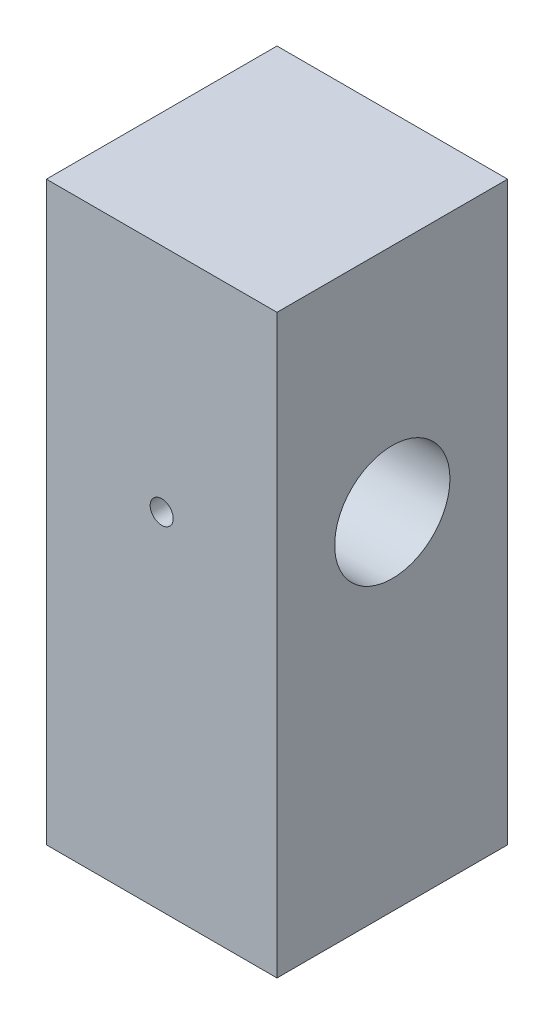
ISO-10303-21;
HEADER;
FILE_DESCRIPTION(('STEP AP214'),'2;1');
FILE_NAME('part.step','',(''),(''),'','','');
FILE_SCHEMA(('AUTOMOTIVE_DESIGN { 1 0 10303 214 1 1 1 1 }'));
ENDSEC;
DATA;
#1=APPLICATION_CONTEXT('core data for automotive mechanical design processes');
#2=APPLICATION_PROTOCOL_DEFINITION('international standard','automotive_design',2000,#1);
#3=PRODUCT_CONTEXT('',#1,'mechanical');
#4=PRODUCT('Part','Part','',(#3));
#5=PRODUCT_RELATED_PRODUCT_CATEGORY('part','',(#4));
#6=PRODUCT_DEFINITION_FORMATION('','',#4);
#7=PRODUCT_DEFINITION_CONTEXT('part definition',#1,'design');
#8=PRODUCT_DEFINITION('design','',#6,#7);
#9=PRODUCT_DEFINITION_SHAPE('','',#8);
#10=(LENGTH_UNIT() NAMED_UNIT(*) SI_UNIT(.MILLI.,.METRE.));
#11=(NAMED_UNIT(*) PLANE_ANGLE_UNIT() SI_UNIT($,.RADIAN.));
#12=(NAMED_UNIT(*) SI_UNIT($,.STERADIAN.) SOLID_ANGLE_UNIT());
#13=UNCERTAINTY_MEASURE_WITH_UNIT(LENGTH_MEASURE(1.E-05),#10,'distance_accuracy_value','');
#14=(GEOMETRIC_REPRESENTATION_CONTEXT(3) GLOBAL_UNCERTAINTY_ASSIGNED_CONTEXT((#13)) GLOBAL_UNIT_ASSIGNED_CONTEXT((#10,
#11,#12)) REPRESENTATION_CONTEXT('',''));
#15=CARTESIAN_POINT('',(0.,0.,0.));
#16=DIRECTION('',(0.,0.,1.));
#17=DIRECTION('',(1.,0.,0.));
#18=AXIS2_PLACEMENT_3D('',#15,#16,#17);
#19=CARTESIAN_POINT('',(20.,0.,0.));
#20=DIRECTION('',(-1.,0.,0.));
#21=DIRECTION('',(0.,0.,1.));
#22=AXIS2_PLACEMENT_3D('',#19,#20,#21);
#23=PLANE('',#22);
#24=DIRECTION('',(0.,0.,1.));
#25=VECTOR('',#24,1.);
#26=CARTESIAN_POINT('',(20.,25.,-10.));
#27=LINE('',#26,#25);
#28=CARTESIAN_POINT('',(20.,25.,-10.));
#29=VERTEX_POINT('',#28);
#30=CARTESIAN_POINT('',(20.,25.,10.));
#31=VERTEX_POINT('',#30);
#32=EDGE_CURVE('E102',#29,#31,#27,.T.);
#33=ORIENTED_EDGE('',*,*,#32,.T.);
#34=DIRECTION('',(0.,-1.,0.));
#35=VECTOR('',#34,1.);
#36=CARTESIAN_POINT('',(20.,-25.,10.));
#37=LINE('',#36,#35);
#38=CARTESIAN_POINT('',(20.,-25.,10.));
#39=VERTEX_POINT('',#38);
#40=EDGE_CURVE('E97',#31,#39,#37,.T.);
#41=ORIENTED_EDGE('',*,*,#40,.T.);
#42=DIRECTION('',(0.,0.,-1.));
#43=VECTOR('',#42,1.);
#44=CARTESIAN_POINT('',(20.,-25.,-10.));
#45=LINE('',#44,#43);
#46=CARTESIAN_POINT('',(20.,-25.,-10.));
#47=VERTEX_POINT('',#46);
#48=EDGE_CURVE('E105',#39,#47,#45,.T.);
#49=ORIENTED_EDGE('',*,*,#48,.T.);
#50=DIRECTION('',(0.,1.,0.));
#51=VECTOR('',#50,1.);
#52=CARTESIAN_POINT('',(20.,-25.,-10.));
#53=LINE('',#52,#51);
#54=EDGE_CURVE('E68',#47,#29,#53,.T.);
#55=ORIENTED_EDGE('',*,*,#54,.T.);
#56=EDGE_LOOP('',(#33,#41,#49,#55));
#57=FACE_BOUND('',#56,.T.);
#58=CARTESIAN_POINT('',(20.,5.,0.));
#59=DIRECTION('',(1.,0.,0.));
#60=DIRECTION('',(0.,0.,-1.));
#61=AXIS2_PLACEMENT_3D('',#58,#59,#60);
#62=CIRCLE('',#61,5.);
#63=CARTESIAN_POINT('',(20.,5.,-5.));
#64=VERTEX_POINT('',#63);
#65=EDGE_CURVE('E125',#64,#64,#62,.T.);
#66=ORIENTED_EDGE('',*,*,#65,.F.);
#67=EDGE_LOOP('',(#66));
#68=FACE_BOUND('',#67,.T.);
#69=ADVANCED_FACE('F42',(#57,#68),#23,.F.);
#70=CARTESIAN_POINT('',(0.,0.,0.));
#71=DIRECTION('',(-1.,0.,0.));
#72=DIRECTION('',(0.,0.,1.));
#73=AXIS2_PLACEMENT_3D('',#70,#71,#72);
#74=PLANE('',#73);
#75=DIRECTION('',(0.,0.,1.));
#76=VECTOR('',#75,1.);
#77=CARTESIAN_POINT('',(0.,25.,-10.));
#78=LINE('',#77,#76);
#79=CARTESIAN_POINT('',(0.,25.,-10.));
#80=VERTEX_POINT('',#79);
#81=CARTESIAN_POINT('',(0.,25.,10.));
#82=VERTEX_POINT('',#81);
#83=EDGE_CURVE('E121',#80,#82,#78,.T.);
#84=ORIENTED_EDGE('',*,*,#83,.F.);
#85=DIRECTION('',(0.,1.,0.));
#86=VECTOR('',#85,1.);
#87=CARTESIAN_POINT('',(0.,-25.,-10.));
#88=LINE('',#87,#86);
#89=CARTESIAN_POINT('',(0.,-25.,-10.));
#90=VERTEX_POINT('',#89);
#91=EDGE_CURVE('E95',#90,#80,#88,.T.);
#92=ORIENTED_EDGE('',*,*,#91,.F.);
#93=DIRECTION('',(0.,0.,-1.));
#94=VECTOR('',#93,1.);
#95=CARTESIAN_POINT('',(0.,-25.,-10.));
#96=LINE('',#95,#94);
#97=CARTESIAN_POINT('',(0.,-25.,10.));
#98=VERTEX_POINT('',#97);
#99=EDGE_CURVE('E88',#98,#90,#96,.T.);
#100=ORIENTED_EDGE('',*,*,#99,.F.);
#101=DIRECTION('',(0.,-1.,0.));
#102=VECTOR('',#101,1.);
#103=CARTESIAN_POINT('',(0.,-25.,10.));
#104=LINE('',#103,#102);
#105=EDGE_CURVE('E108',#82,#98,#104,.T.);
#106=ORIENTED_EDGE('',*,*,#105,.F.);
#107=EDGE_LOOP('',(#84,#92,#100,#106));
#108=FACE_BOUND('',#107,.T.);
#109=CARTESIAN_POINT('',(0.,5.,0.));
#110=DIRECTION('',(1.,0.,0.));
#111=DIRECTION('',(0.,0.,-1.));
#112=AXIS2_PLACEMENT_3D('',#109,#110,#111);
#113=CIRCLE('',#112,5.);
#114=CARTESIAN_POINT('',(0.,5.,-5.));
#115=VERTEX_POINT('',#114);
#116=EDGE_CURVE('E188',#115,#115,#113,.T.);
#117=ORIENTED_EDGE('',*,*,#116,.T.);
#118=EDGE_LOOP('',(#117));
#119=FACE_BOUND('',#118,.T.);
#120=ADVANCED_FACE('F159',(#108,#119),#74,.T.);
#121=CARTESIAN_POINT('',(20.,25.,-10.));
#122=DIRECTION('',(0.,-1.,0.));
#123=DIRECTION('',(0.,0.,-1.));
#124=AXIS2_PLACEMENT_3D('',#121,#122,#123);
#125=PLANE('',#124);
#126=ORIENTED_EDGE('',*,*,#83,.T.);
#127=DIRECTION('',(-1.,0.,0.));
#128=VECTOR('',#127,1.);
#129=CARTESIAN_POINT('',(20.,25.,10.));
#130=LINE('',#129,#128);
#131=EDGE_CURVE('E11',#31,#82,#130,.T.);
#132=ORIENTED_EDGE('',*,*,#131,.F.);
#133=ORIENTED_EDGE('',*,*,#32,.F.);
#134=DIRECTION('',(-1.,0.,0.));
#135=VECTOR('',#134,1.);
#136=CARTESIAN_POINT('',(20.,25.,-10.));
#137=LINE('',#136,#135);
#138=EDGE_CURVE('E120',#29,#80,#137,.T.);
#139=ORIENTED_EDGE('',*,*,#138,.T.);
#140=EDGE_LOOP('',(#126,#132,#133,#139));
#141=FACE_BOUND('',#140,.T.);
#142=ADVANCED_FACE('F46',(#141),#125,.F.);
#143=CARTESIAN_POINT('',(20.,-25.,10.));
#144=DIRECTION('',(0.,0.,-1.));
#145=DIRECTION('',(-1.,0.,0.));
#146=AXIS2_PLACEMENT_3D('',#143,#144,#145);
#147=PLANE('',#146);
#148=CARTESIAN_POINT('',(10.,5.,10.));
#149=DIRECTION('',(0.,0.,-1.));
#150=DIRECTION('',(0.,1.,0.));
#151=AXIS2_PLACEMENT_3D('',#148,#149,#150);
#152=CIRCLE('',#151,1.);
#153=CARTESIAN_POINT('',(10.,6.,10.));
#154=VERTEX_POINT('',#153);
#155=EDGE_CURVE('E143',#154,#154,#152,.T.);
#156=ORIENTED_EDGE('',*,*,#155,.T.);
#157=EDGE_LOOP('',(#156));
#158=FACE_BOUND('',#157,.T.);
#159=ORIENTED_EDGE('',*,*,#105,.T.);
#160=DIRECTION('',(-1.,0.,0.));
#161=VECTOR('',#160,1.);
#162=CARTESIAN_POINT('',(20.,-25.,10.));
#163=LINE('',#162,#161);
#164=EDGE_CURVE('E58',#39,#98,#163,.T.);
#165=ORIENTED_EDGE('',*,*,#164,.F.);
#166=ORIENTED_EDGE('',*,*,#40,.F.);
#167=ORIENTED_EDGE('',*,*,#131,.T.);
#168=EDGE_LOOP('',(#159,#165,#166,#167));
#169=FACE_BOUND('',#168,.T.);
#170=ADVANCED_FACE('F107',(#158,#169),#147,.F.);
#171=CARTESIAN_POINT('',(20.,-25.,-10.));
#172=DIRECTION('',(0.,1.,0.));
#173=DIRECTION('',(0.,0.,1.));
#174=AXIS2_PLACEMENT_3D('',#171,#172,#173);
#175=PLANE('',#174);
#176=ORIENTED_EDGE('',*,*,#99,.T.);
#177=DIRECTION('',(-1.,0.,0.));
#178=VECTOR('',#177,1.);
#179=CARTESIAN_POINT('',(20.,-25.,-10.));
#180=LINE('',#179,#178);
#181=EDGE_CURVE('E112',#47,#90,#180,.T.);
#182=ORIENTED_EDGE('',*,*,#181,.F.);
#183=ORIENTED_EDGE('',*,*,#48,.F.);
#184=ORIENTED_EDGE('',*,*,#164,.T.);
#185=EDGE_LOOP('',(#176,#182,#183,#184));
#186=FACE_BOUND('',#185,.T.);
#187=ADVANCED_FACE('F114',(#186),#175,.F.);
#188=CARTESIAN_POINT('',(20.,-25.,-10.));
#189=DIRECTION('',(0.,0.,1.));
#190=DIRECTION('',(0.,-1.,0.));
#191=AXIS2_PLACEMENT_3D('',#188,#189,#190);
#192=PLANE('',#191);
#193=CARTESIAN_POINT('',(10.,5.00000000000001,-10.));
#194=DIRECTION('',(0.,0.,-1.));
#195=DIRECTION('',(0.,1.,0.));
#196=AXIS2_PLACEMENT_3D('',#193,#194,#195);
#197=CIRCLE('',#196,1.);
#198=CARTESIAN_POINT('',(10.,6.00000000000001,-10.));
#199=VERTEX_POINT('',#198);
#200=EDGE_CURVE('E182',#199,#199,#197,.T.);
#201=ORIENTED_EDGE('',*,*,#200,.F.);
#202=EDGE_LOOP('',(#201));
#203=FACE_BOUND('',#202,.T.);
#204=ORIENTED_EDGE('',*,*,#91,.T.);
#205=ORIENTED_EDGE('',*,*,#138,.F.);
#206=ORIENTED_EDGE('',*,*,#54,.F.);
#207=ORIENTED_EDGE('',*,*,#181,.T.);
#208=EDGE_LOOP('',(#204,#205,#206,#207));
#209=FACE_BOUND('',#208,.T.);
#210=ADVANCED_FACE('F156',(#203,#209),#192,.F.);
#211=CARTESIAN_POINT('',(20.,5.,0.));
#212=DIRECTION('',(-1.,0.,0.));
#213=DIRECTION('',(0.,0.,1.));
#214=AXIS2_PLACEMENT_3D('',#211,#212,#213);
#215=CYLINDRICAL_SURFACE('',#214,5.);
#216=CARTESIAN_POINT('',(11.,5.,5.));
#217=CARTESIAN_POINT('',(10.9999979555017,4.94442309320737,4.99999897580871));
#218=CARTESIAN_POINT('',(10.9953511570324,4.88882033979848,4.99906385178231));
#219=CARTESIAN_POINT('',(10.9769014998848,4.77918649231099,4.99542365623231));
#220=CARTESIAN_POINT('',(10.9630913671985,4.72515668245865,4.99271717860186));
#221=CARTESIAN_POINT('',(10.9267587263792,4.62026969473669,4.98583649278287));
#222=CARTESIAN_POINT('',(10.9042445631553,4.56940953206687,4.98166369076718));
#223=CARTESIAN_POINT('',(10.8511677524887,4.47219201113578,4.97230398035314));
#224=CARTESIAN_POINT('',(10.8206055843928,4.42583438492419,4.96711713235707));
#225=CARTESIAN_POINT('',(10.7518615057086,4.33830652268514,4.9562216532997));
#226=CARTESIAN_POINT('',(10.7135916446088,4.29720604884148,4.95050745504347));
#227=CARTESIAN_POINT('',(10.6307075836083,4.22196324339198,4.93924180452588));
#228=CARTESIAN_POINT('',(10.5860928886649,4.18782145522958,4.93369036500424));
#229=CARTESIAN_POINT('',(10.4912838069881,4.12716824665238,4.92332441812615));
#230=CARTESIAN_POINT('',(10.4410423562036,4.10072906113414,4.91851707364946));
#231=CARTESIAN_POINT('',(10.3367181809959,4.0566943334197,4.91026268058418));
#232=CARTESIAN_POINT('',(10.2826358366537,4.03909791756277,4.90681549761962));
#233=CARTESIAN_POINT('',(10.1729156360921,4.01347470011518,4.90172805252204));
#234=CARTESIAN_POINT('',(10.1173074558578,4.00532550204123,4.90006470107188));
#235=CARTESIAN_POINT('',(10.0054901786357,3.99844787227388,4.89866375060627));
#236=CARTESIAN_POINT('',(9.94928114367985,3.9997184772865,4.89892595467841));
#237=CARTESIAN_POINT('',(9.83875321197899,4.01154542689819,4.90132551148185));
#238=CARTESIAN_POINT('',(9.78441859437269,4.0219614597561,4.90343452858763));
#239=CARTESIAN_POINT('',(9.678283923337,4.05156211537695,4.90924546160001));
#240=CARTESIAN_POINT('',(9.62648399108099,4.07074715689932,4.91294745357779));
#241=CARTESIAN_POINT('',(9.5264847382964,4.11747521632528,4.92155618500408));
#242=CARTESIAN_POINT('',(9.47831212043083,4.14507384876789,4.92647089813704));
#243=CARTESIAN_POINT('',(9.38722915002719,4.20780642542733,4.93694618773062));
#244=CARTESIAN_POINT('',(9.34431940314884,4.24294123564318,4.94250683838366));
#245=CARTESIAN_POINT('',(9.26417059754306,4.32050006543942,4.95377021241462));
#246=CARTESIAN_POINT('',(9.22704743214087,4.36304383878756,4.95947369210905));
#247=CARTESIAN_POINT('',(9.16044615369878,4.45381497593799,4.97028848714408));
#248=CARTESIAN_POINT('',(9.13096813870642,4.50204241262061,4.97539979488974));
#249=CARTESIAN_POINT('',(9.08047249077402,4.60294061312108,4.98446690160887));
#250=CARTESIAN_POINT('',(9.05946810635546,4.6556181804147,4.98842088848272));
#251=CARTESIAN_POINT('',(9.02663952596143,4.76385102355134,4.99471408987858));
#252=CARTESIAN_POINT('',(9.01481421792637,4.81940594992755,4.99705350000531));
#253=CARTESIAN_POINT('',(9.00084354620572,4.93082059437285,4.99982671866868));
#254=CARTESIAN_POINT('',(8.99853958045973,4.98665967167443,5.0002917465247));
#255=CARTESIAN_POINT('',(9.00324985894218,5.09792493419272,4.99935051930103));
#256=CARTESIAN_POINT('',(9.0102635793526,5.1533511424438,4.99794436941446));
#257=CARTESIAN_POINT('',(9.03327837354396,5.26170565994654,4.99343832008018));
#258=CARTESIAN_POINT('',(9.0491980684979,5.31465194833991,4.99035376404206));
#259=CARTESIAN_POINT('',(9.08948398265581,5.41712362749967,4.98283552061033));
#260=CARTESIAN_POINT('',(9.11385083467683,5.46664876163754,4.97840173214227));
#261=CARTESIAN_POINT('',(9.17068249065131,5.56154117368622,4.96859911533294));
#262=CARTESIAN_POINT('',(9.20324278103895,5.60685012675219,4.96321950437052));
#263=CARTESIAN_POINT('',(9.27540919120728,5.69141801911921,4.95214734829882));
#264=CARTESIAN_POINT('',(9.31501606639987,5.73067630893077,4.94645476968388));
#265=CARTESIAN_POINT('',(9.40087335189112,5.80264059077418,4.93529303556965));
#266=CARTESIAN_POINT('',(9.44721574422134,5.83523770244866,4.92982860233304));
#267=CARTESIAN_POINT('',(9.54481136135668,5.89218542005121,4.91984191796194));
#268=CARTESIAN_POINT('',(9.59606438957355,5.91653635592291,4.91531962913342));
#269=CARTESIAN_POINT('',(9.70176824614955,5.95615184158196,4.90776740584383));
#270=CARTESIAN_POINT('',(9.75620084121032,5.97146349979105,4.90472974872187));
#271=CARTESIAN_POINT('',(9.86693345349091,5.9927086516272,4.90047436792025));
#272=CARTESIAN_POINT('',(9.92323322620935,5.99864336822512,4.89925640691111));
#273=CARTESIAN_POINT('',(10.0350088645443,6.00092091086747,4.89879149631379));
#274=CARTESIAN_POINT('',(10.090481148927,5.9974357880709,4.89950919189301));
#275=CARTESIAN_POINT('',(10.200031649905,5.98135230410006,4.90275573484614));
#276=CARTESIAN_POINT('',(10.2541098776948,5.9687540161293,4.90528456767169));
#277=CARTESIAN_POINT('',(10.3592277112405,5.93487856849896,4.91185264219159));
#278=CARTESIAN_POINT('',(10.4102743605024,5.91362250671735,4.91588821018831));
#279=CARTESIAN_POINT('',(10.5081037207344,5.86305464460161,4.9250171497417));
#280=CARTESIAN_POINT('',(10.5548860737251,5.83374216877489,4.93011060998894));
#281=CARTESIAN_POINT('',(10.6437155721503,5.76730591478642,4.94088960523225));
#282=CARTESIAN_POINT('',(10.6856687652676,5.73005788723518,4.946583729097));
#283=CARTESIAN_POINT('',(10.7627862055292,5.64906436901314,4.95786081871955));
#284=CARTESIAN_POINT('',(10.7979488903173,5.60531738715334,4.96344375863185));
#285=CARTESIAN_POINT('',(10.8608346439464,5.51201762908825,4.97393832387971));
#286=CARTESIAN_POINT('',(10.88847600328,5.46240888442984,4.97884231219246));
#287=CARTESIAN_POINT('',(10.9349861225966,5.35916636094074,4.98735125085));
#288=CARTESIAN_POINT('',(10.9538627895325,5.30553626086313,4.99095737138616));
#289=CARTESIAN_POINT('',(10.9786519480447,5.20982148892378,4.99576372595371));
#290=CARTESIAN_POINT('',(10.9866431937078,5.16828166401379,4.99734303158452));
#291=CARTESIAN_POINT('',(10.9973179123584,5.08449952521007,4.99946154139893));
#292=CARTESIAN_POINT('',(11.0000015545098,5.04225723374862,5.00000077873155));
#293=CARTESIAN_POINT('',(11.,5.,5.));
#294=B_SPLINE_CURVE_WITH_KNOTS('',3,(#216,#217,#218,#219,#220,#221,#222,#223,#224,#225,#226,
#227,#228,#229,#230,#231,#232,#233,#234,#235,#236,#237,#238,#239,#240,#241,#242,#243,#244,#245,
#246,#247,#248,#249,#250,#251,#252,#253,#254,#255,#256,#257,#258,#259,#260,#261,#262,#263,#264,
#265,#266,#267,#268,#269,#270,#271,#272,#273,#274,#275,#276,#277,#278,#279,#280,#281,#282,#283,
#284,#285,#286,#287,#288,#289,#290,#291,#292,#293),.UNSPECIFIED.,.T.,.F.,(4,2,2,2,2,2,2,2,2,2,2,
2,2,2,2,2,2,2,2,2,2,2,2,2,2,2,2,2,2,2,2,2,2,2,2,2,2,2,4),(0.,0.166576130661259,
0.333284650691323,0.499833735250341,0.666372902230863,0.834932670112186,1.00350559674737,
1.17361195005923,1.34370149365198,1.51156185103587,1.67940504281225,1.84471727006278,
2.0100373925373,2.17647490203593,2.3429315474967,2.51238252491351,2.6818356753982,
2.85155274854024,3.02124925698036,3.18810735676265,3.35495607657868,3.52030453950723,
3.68566539216022,3.85305066033359,4.0204538834593,4.19040628579226,4.36035188723466,
4.52940381032723,4.69843368330415,4.86439722567701,5.03035943492608,5.1959196125311,
5.36149367581866,5.52988076239143,5.6983065453293,5.86849496675637,6.03852955517518,
6.16518775289894,6.29184191370996),.UNSPECIFIED.);
#295=CARTESIAN_POINT('',(11.,5.,5.));
#296=VERTEX_POINT('',#295);
#297=EDGE_CURVE('E48',#296,#296,#294,.T.);
#298=ORIENTED_EDGE('',*,*,#297,.F.);
#299=EDGE_LOOP('',(#298));
#300=FACE_BOUND('',#299,.T.);
#301=CARTESIAN_POINT('',(10.,6.,-4.89897948556636));
#302=CARTESIAN_POINT('',(9.94443562451802,5.99999794587605,-4.89898059043933));
#303=CARTESIAN_POINT('',(9.88884537669351,5.99535317172366,-4.89993508346913));
#304=CARTESIAN_POINT('',(9.77923749488159,5.97691228358834,-4.90364431385263));
#305=CARTESIAN_POINT('',(9.72522115536893,5.96310884707119,-4.90640049166333));
#306=CARTESIAN_POINT('',(9.62036269663707,5.92679578261774,-4.91338873700356));
#307=CARTESIAN_POINT('',(9.56951747846507,5.90429481415209,-4.91761933615313));
#308=CARTESIAN_POINT('',(9.47232515530538,5.85124910767105,-4.92707799486421));
#309=CARTESIAN_POINT('',(9.42597779946273,5.8207048186013,-4.93230599875014));
#310=CARTESIAN_POINT('',(9.3384389961455,5.75197907565329,-4.9432529969268));
#311=CARTESIAN_POINT('',(9.29732041211586,5.71370565591328,-4.94897737836825));
#312=CARTESIAN_POINT('',(9.22204246642119,5.63080678902135,-4.9602247230302));
#313=CARTESIAN_POINT('',(9.18788359258285,5.586180896978,-4.96574767210945));
#314=CARTESIAN_POINT('',(9.1272119823715,5.49136135592425,-4.97602796417448));
#315=CARTESIAN_POINT('',(9.10076848618335,5.44112256767221,-4.9807782144152));
#316=CARTESIAN_POINT('',(9.05672506295188,5.33680415038728,-4.98891736883662));
#317=CARTESIAN_POINT('',(9.03912430809901,5.28272488142056,-4.99230640044127));
#318=CARTESIAN_POINT('',(9.01349280638037,5.1730167732785,-4.9973032068841));
#319=CARTESIAN_POINT('',(9.00533902242899,5.11741773921482,-4.99893386288125));
#320=CARTESIAN_POINT('',(8.99844904816169,5.00561856843754,-5.00030921183606));
#321=CARTESIAN_POINT('',(8.99971195035418,4.94941849016816,-5.00005408652759));
#322=CARTESIAN_POINT('',(9.01152618021555,4.83885799925642,-4.99770434868515));
#323=CARTESIAN_POINT('',(9.02194497716785,4.78448278570154,-4.99563598365838));
#324=CARTESIAN_POINT('',(9.05156503245889,4.67826837341971,-4.98992177159409));
#325=CARTESIAN_POINT('',(9.07076664219187,4.62642927625288,-4.98627586144039));
#326=CARTESIAN_POINT('',(9.11753004014727,4.52638053679912,-4.97777296019958));
#327=CARTESIAN_POINT('',(9.14514375110489,4.47819582586611,-4.97290848175224));
#328=CARTESIAN_POINT('',(9.2079090772366,4.38709495414025,-4.96250469473785));
#329=CARTESIAN_POINT('',(9.24306155977052,4.344179400475,-4.95696530855222));
#330=CARTESIAN_POINT('',(9.32063362210847,4.26404856894655,-4.9457096436446));
#331=CARTESIAN_POINT('',(9.36316918672959,4.22694568342637,-4.93999196457516));
#332=CARTESIAN_POINT('',(9.45391644245075,4.1603815068232,-4.92911571598761));
#333=CARTESIAN_POINT('',(9.5021282408832,4.13092036027225,-4.92395715704548));
#334=CARTESIAN_POINT('',(9.60302083182181,4.08043718519812,-4.91478047472924));
#335=CARTESIAN_POINT('',(9.65571096763966,4.0594333522223,-4.91076481563549));
#336=CARTESIAN_POINT('',(9.76397132372399,4.02660965837242,-4.90436476321273));
#337=CARTESIAN_POINT('',(9.81954116761908,4.01478860054336,-4.90198015728428));
#338=CARTESIAN_POINT('',(9.93096485799904,4.00083399396395,-4.89915479267828));
#339=CARTESIAN_POINT('',(9.98679757431034,3.99853814110209,-4.89868147057154));
#340=CARTESIAN_POINT('',(10.0980482231997,4.00326237168927,-4.89964485688854));
#341=CARTESIAN_POINT('',(10.1534661791189,4.01028192687756,-4.90108145700388));
#342=CARTESIAN_POINT('',(10.2617686402922,4.03329779192585,-4.90567232494915));
#343=CARTESIAN_POINT('',(10.3146723430358,4.04920737916071,-4.90880999014497));
#344=CARTESIAN_POINT('',(10.4170632790287,4.08945896469149,-4.91643489351665));
#345=CARTESIAN_POINT('',(10.4665502304357,4.11380165762683,-4.9209222428627));
#346=CARTESIAN_POINT('',(10.5614131099502,4.17059585778441,-4.93081405962039));
#347=CARTESIAN_POINT('',(10.6067270463008,4.20314892201725,-4.93622971864903));
#348=CARTESIAN_POINT('',(10.6913083120009,4.27530442778729,-4.94733723826636));
#349=CARTESIAN_POINT('',(10.7305750182493,4.31490759485547,-4.95302912723818));
#350=CARTESIAN_POINT('',(10.8025625591856,4.40076772650211,-4.96415345869216));
#351=CARTESIAN_POINT('',(10.83517365465,4.44711750107037,-4.96958057708684));
#352=CARTESIAN_POINT('',(10.8921458814996,4.54473210336525,-4.9794712762862));
#353=CARTESIAN_POINT('',(10.9165073593448,4.5959967245665,-4.98393489755211));
#354=CARTESIAN_POINT('',(10.9561288717466,4.70169731917599,-4.99137294061067));
#355=CARTESIAN_POINT('',(10.9714405182263,4.75611332652193,-4.99435579142604));
#356=CARTESIAN_POINT('',(10.9926912476638,4.86681054532009,-4.9985323593766));
#357=CARTESIAN_POINT('',(10.9986314594757,4.92309153128879,-4.99972629199843));
#358=CARTESIAN_POINT('',(11.0009269809629,5.03487289390363,-5.00018540454121));
#359=CARTESIAN_POINT('',(10.9974472804562,5.09036981214151,-4.99948378549351));
#360=CARTESIAN_POINT('',(10.9813660494522,5.19997103131565,-4.99630043560318));
#361=CARTESIAN_POINT('',(10.9687646336519,5.2540753497537,-4.99381872714351));
#362=CARTESIAN_POINT('',(10.9348710079084,5.3592527497451,-4.98735498365001));
#363=CARTESIAN_POINT('',(10.9135986218688,5.41033244324028,-4.98337637247912));
#364=CARTESIAN_POINT('',(10.8629877586691,5.50822122018596,-4.97434722123382));
#365=CARTESIAN_POINT('',(10.8336486440963,5.55502996576742,-4.96929659645878));
#366=CARTESIAN_POINT('',(10.7671806129379,5.64386389010636,-4.95857599157868));
#367=CARTESIAN_POINT('',(10.7299336636132,5.68579971611651,-4.95289733422142));
#368=CARTESIAN_POINT('',(10.6489497599042,5.76288261775685,-4.94161222903622));
#369=CARTESIAN_POINT('',(10.6052112705313,5.79802808320272,-4.93600579862875));
#370=CARTESIAN_POINT('',(10.5119206832998,5.8608922194552,-4.92543342749964));
#371=CARTESIAN_POINT('',(10.4623110388396,5.88852681463977,-4.92047503631328));
#372=CARTESIAN_POINT('',(10.3590672267003,5.93502404928781,-4.91185237184445));
#373=CARTESIAN_POINT('',(10.3054367613021,5.95389464597929,-4.90818692536957));
#374=CARTESIAN_POINT('',(10.2097375445634,5.97866913985428,-4.90329681128922));
#375=CARTESIAN_POINT('',(10.1682145804885,5.98665389852299,-4.90168784915661));
#376=CARTESIAN_POINT('',(10.0844660454464,5.99732001796041,-4.8995287845803));
#377=CARTESIAN_POINT('',(10.0422404987518,6.00000156156206,-4.89897864563277));
#378=CARTESIAN_POINT('',(10.,6.,-4.89897948556636));
#379=B_SPLINE_CURVE_WITH_KNOTS('',3,(#301,#302,#303,#304,#305,#306,#307,#308,#309,#310,#311,
#312,#313,#314,#315,#316,#317,#318,#319,#320,#321,#322,#323,#324,#325,#326,#327,#328,#329,#330,
#331,#332,#333,#334,#335,#336,#337,#338,#339,#340,#341,#342,#343,#344,#345,#346,#347,#348,#349,
#350,#351,#352,#353,#354,#355,#356,#357,#358,#359,#360,#361,#362,#363,#364,#365,#366,#367,#368,
#369,#370,#371,#372,#373,#374,#375,#376,#377,#378),.UNSPECIFIED.,.T.,.F.,(4,2,2,2,2,2,2,2,2,2,2,
2,2,2,2,2,2,2,2,2,2,2,2,2,2,2,2,2,2,2,2,2,2,2,2,2,2,2,4),(0.,0.166538463856523,
0.333210239259265,0.499716497915554,0.666213464834831,0.834822525459336,1.00344340032919,
1.17353400434947,1.34360868244057,1.51144248880577,1.67926012113745,1.84468789631034,
2.01012229071247,2.176599242198,2.34309535767563,2.5124934675998,2.68189478120217,
2.85165863170273,3.02140035013521,3.1882375780209,3.35506534525918,3.52029341780816,
3.68553510351895,3.85293059772018,4.02034332867705,4.19032601730948,4.36030156627602,
4.52929813576147,4.69827434689125,4.86431017412183,5.03034391364253,5.19600017072949,
5.36166952132181,5.53001152023093,5.69839338887278,5.86858898576538,6.03862975086429,
6.16523803634393,6.29184195681711),.UNSPECIFIED.);
#380=CARTESIAN_POINT('',(10.,6.,-4.89897948556636));
#381=VERTEX_POINT('',#380);
#382=EDGE_CURVE('E133',#381,#381,#379,.T.);
#383=ORIENTED_EDGE('',*,*,#382,.F.);
#384=EDGE_LOOP('',(#383));
#385=FACE_BOUND('',#384,.T.);
#386=ORIENTED_EDGE('',*,*,#65,.T.);
#387=EDGE_LOOP('',(#386));
#388=FACE_BOUND('',#387,.T.);
#389=ORIENTED_EDGE('',*,*,#116,.F.);
#390=EDGE_LOOP('',(#389));
#391=FACE_BOUND('',#390,.T.);
#392=ADVANCED_FACE('F142',(#300,#385,#388,#391),#215,.F.);
#393=CARTESIAN_POINT('',(10.,5.,10.));
#394=DIRECTION('',(0.,0.,-1.));
#395=DIRECTION('',(0.,1.,0.));
#396=AXIS2_PLACEMENT_3D('',#393,#394,#395);
#397=CYLINDRICAL_SURFACE('',#396,1.);
#398=ORIENTED_EDGE('',*,*,#382,.T.);
#399=EDGE_LOOP('',(#398));
#400=FACE_BOUND('',#399,.T.);
#401=ORIENTED_EDGE('',*,*,#200,.T.);
#402=EDGE_LOOP('',(#401));
#403=FACE_BOUND('',#402,.T.);
#404=ADVANCED_FACE('F144',(#400,#403),#397,.F.);
#405=ORIENTED_EDGE('',*,*,#297,.T.);
#406=EDGE_LOOP('',(#405));
#407=FACE_BOUND('',#406,.T.);
#408=ORIENTED_EDGE('',*,*,#155,.F.);
#409=EDGE_LOOP('',(#408));
#410=FACE_BOUND('',#409,.T.);
#411=ADVANCED_FACE('F146',(#407,#410),#397,.F.);
#412=CLOSED_SHELL('',(#69,#120,#142,#170,#187,#210,#392,#404,#411));
#413=MANIFOLD_SOLID_BREP('B2',#412);
#414=ADVANCED_BREP_SHAPE_REPRESENTATION('',(#18,#413),#14);
#415=SHAPE_DEFINITION_REPRESENTATION(#9,#414);
ENDSEC;
END-ISO-10303-21;
